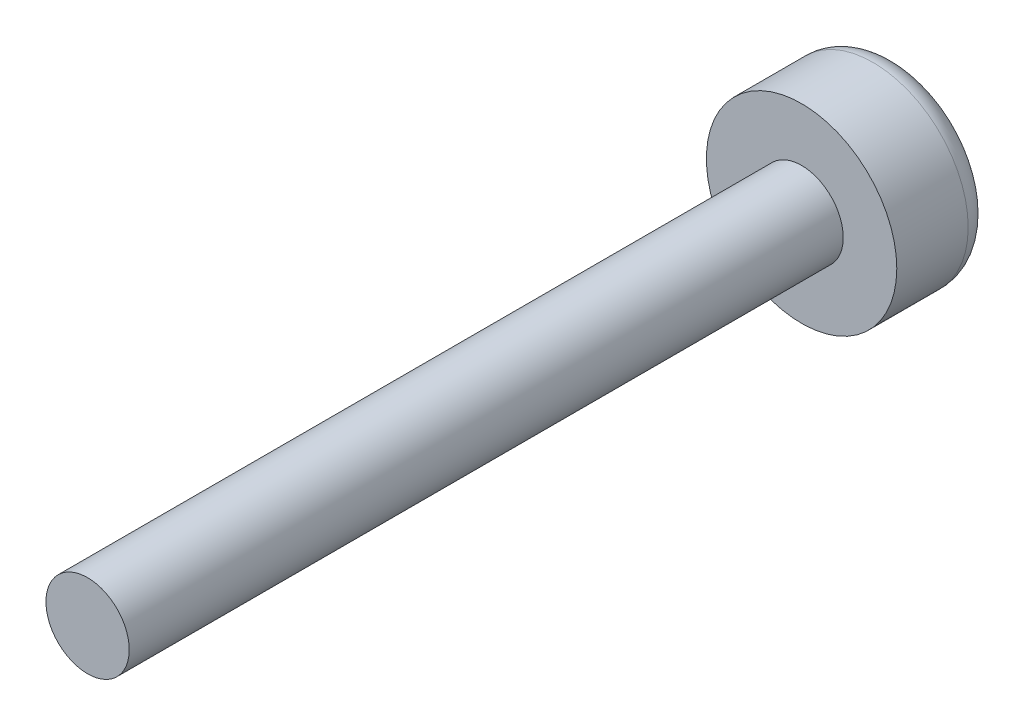
ISO-10303-21;
HEADER;
FILE_DESCRIPTION(('STEP AP214'),'2;1');
FILE_NAME('part.step','',(''),(''),'','','');
FILE_SCHEMA(('AUTOMOTIVE_DESIGN { 1 0 10303 214 1 1 1 1 }'));
ENDSEC;
DATA;
#1=APPLICATION_CONTEXT('core data for automotive mechanical design processes');
#2=APPLICATION_PROTOCOL_DEFINITION('international standard','automotive_design',2000,#1);
#3=PRODUCT_CONTEXT('',#1,'mechanical');
#4=PRODUCT('Part','Part','',(#3));
#5=PRODUCT_RELATED_PRODUCT_CATEGORY('part','',(#4));
#6=PRODUCT_DEFINITION_FORMATION('','',#4);
#7=PRODUCT_DEFINITION_CONTEXT('part definition',#1,'design');
#8=PRODUCT_DEFINITION('design','',#6,#7);
#9=PRODUCT_DEFINITION_SHAPE('','',#8);
#10=(LENGTH_UNIT() NAMED_UNIT(*) SI_UNIT(.MILLI.,.METRE.));
#11=(NAMED_UNIT(*) PLANE_ANGLE_UNIT() SI_UNIT($,.RADIAN.));
#12=(NAMED_UNIT(*) SI_UNIT($,.STERADIAN.) SOLID_ANGLE_UNIT());
#13=UNCERTAINTY_MEASURE_WITH_UNIT(LENGTH_MEASURE(1.E-05),#10,'distance_accuracy_value','');
#14=(GEOMETRIC_REPRESENTATION_CONTEXT(3) GLOBAL_UNCERTAINTY_ASSIGNED_CONTEXT((#13)) GLOBAL_UNIT_ASSIGNED_CONTEXT((#10,
#11,#12)) REPRESENTATION_CONTEXT('',''));
#15=CARTESIAN_POINT('',(0.,0.,0.));
#16=DIRECTION('',(0.,0.,1.));
#17=DIRECTION('',(1.,0.,0.));
#18=AXIS2_PLACEMENT_3D('',#15,#16,#17);
#19=CARTESIAN_POINT('',(0.,0.,4.));
#20=DIRECTION('',(0.,0.,-1.));
#21=DIRECTION('',(-1.,0.,0.));
#22=AXIS2_PLACEMENT_3D('',#19,#20,#21);
#23=CYLINDRICAL_SURFACE('',#22,4.);
#24=CARTESIAN_POINT('',(0.,0.,1.));
#25=DIRECTION('',(0.,0.,1.));
#26=DIRECTION('',(1.,0.,0.));
#27=AXIS2_PLACEMENT_3D('',#24,#25,#26);
#28=CIRCLE('',#27,4.);
#29=CARTESIAN_POINT('',(4.,0.,1.));
#30=VERTEX_POINT('',#29);
#31=EDGE_CURVE('E51',#30,#30,#28,.T.);
#32=ORIENTED_EDGE('',*,*,#31,.T.);
#33=EDGE_LOOP('',(#32));
#34=FACE_BOUND('',#33,.T.);
#35=CARTESIAN_POINT('',(0.,0.,4.));
#36=DIRECTION('',(0.,0.,1.));
#37=DIRECTION('',(1.,0.,0.));
#38=AXIS2_PLACEMENT_3D('',#35,#36,#37);
#39=CIRCLE('',#38,4.);
#40=CARTESIAN_POINT('',(4.,0.,4.));
#41=VERTEX_POINT('',#40);
#42=EDGE_CURVE('E61',#41,#41,#39,.T.);
#43=ORIENTED_EDGE('',*,*,#42,.F.);
#44=EDGE_LOOP('',(#43));
#45=FACE_BOUND('',#44,.T.);
#46=ADVANCED_FACE('F43',(#34,#45),#23,.T.);
#47=CARTESIAN_POINT('',(0.,0.,4.));
#48=DIRECTION('',(0.,0.,1.));
#49=DIRECTION('',(1.,0.,0.));
#50=AXIS2_PLACEMENT_3D('',#47,#48,#49);
#51=PLANE('',#50);
#52=CARTESIAN_POINT('',(0.,0.,4.));
#53=DIRECTION('',(0.,0.,1.));
#54=DIRECTION('',(1.,0.,0.));
#55=AXIS2_PLACEMENT_3D('',#52,#53,#54);
#56=CIRCLE('',#55,1.75);
#57=CARTESIAN_POINT('',(1.75,0.,4.));
#58=VERTEX_POINT('',#57);
#59=EDGE_CURVE('E56',#58,#58,#56,.T.);
#60=ORIENTED_EDGE('',*,*,#59,.F.);
#61=EDGE_LOOP('',(#60));
#62=FACE_BOUND('',#61,.T.);
#63=ORIENTED_EDGE('',*,*,#42,.T.);
#64=EDGE_LOOP('',(#63));
#65=FACE_BOUND('',#64,.T.);
#66=ADVANCED_FACE('F81',(#62,#65),#51,.T.);
#67=CARTESIAN_POINT('',(0.,0.,0.));
#68=DIRECTION('',(0.,0.,1.));
#69=DIRECTION('',(1.,0.,0.));
#70=AXIS2_PLACEMENT_3D('',#67,#68,#69);
#71=PLANE('',#70);
#72=CARTESIAN_POINT('',(0.,0.,0.));
#73=DIRECTION('',(0.,0.,1.));
#74=DIRECTION('',(1.,0.,0.));
#75=AXIS2_PLACEMENT_3D('',#72,#73,#74);
#76=CIRCLE('',#75,3.);
#77=CARTESIAN_POINT('',(3.,0.,0.));
#78=VERTEX_POINT('',#77);
#79=EDGE_CURVE('E10',#78,#78,#76,.F.);
#80=ORIENTED_EDGE('',*,*,#79,.T.);
#81=EDGE_LOOP('',(#80));
#82=FACE_BOUND('',#81,.T.);
#83=ADVANCED_FACE('F77',(#82),#71,.F.);
#84=CARTESIAN_POINT('',(0.,0.,34.));
#85=DIRECTION('',(0.,0.,-1.));
#86=DIRECTION('',(-1.,0.,0.));
#87=AXIS2_PLACEMENT_3D('',#84,#85,#86);
#88=CYLINDRICAL_SURFACE('',#87,1.75);
#89=CARTESIAN_POINT('',(0.,0.,34.));
#90=DIRECTION('',(0.,0.,1.));
#91=DIRECTION('',(1.,0.,0.));
#92=AXIS2_PLACEMENT_3D('',#89,#90,#91);
#93=CIRCLE('',#92,1.75);
#94=CARTESIAN_POINT('',(1.75,0.,34.));
#95=VERTEX_POINT('',#94);
#96=EDGE_CURVE('E66',#95,#95,#93,.T.);
#97=ORIENTED_EDGE('',*,*,#96,.F.);
#98=EDGE_LOOP('',(#97));
#99=FACE_BOUND('',#98,.T.);
#100=ORIENTED_EDGE('',*,*,#59,.T.);
#101=EDGE_LOOP('',(#100));
#102=FACE_BOUND('',#101,.T.);
#103=ADVANCED_FACE('F74',(#99,#102),#88,.T.);
#104=CARTESIAN_POINT('',(0.,0.,34.));
#105=DIRECTION('',(0.,0.,1.));
#106=DIRECTION('',(1.,0.,0.));
#107=AXIS2_PLACEMENT_3D('',#104,#105,#106);
#108=PLANE('',#107);
#109=ORIENTED_EDGE('',*,*,#96,.T.);
#110=EDGE_LOOP('',(#109));
#111=FACE_BOUND('',#110,.T.);
#112=ADVANCED_FACE('F72',(#111),#108,.T.);
#113=CARTESIAN_POINT('',(0.,0.,1.));
#114=DIRECTION('',(0.,0.,1.));
#115=DIRECTION('',(1.,0.,0.));
#116=AXIS2_PLACEMENT_3D('',#113,#114,#115);
#117=TOROIDAL_SURFACE('',#116,3.,1.);
#118=ORIENTED_EDGE('',*,*,#79,.F.);
#119=EDGE_LOOP('',(#118));
#120=FACE_BOUND('',#119,.T.);
#121=ORIENTED_EDGE('',*,*,#31,.F.);
#122=EDGE_LOOP('',(#121));
#123=FACE_BOUND('',#122,.T.);
#124=ADVANCED_FACE('F45',(#120,#123),#117,.T.);
#125=CLOSED_SHELL('',(#46,#66,#83,#103,#112,#124));
#126=MANIFOLD_SOLID_BREP('B2',#125);
#127=ADVANCED_BREP_SHAPE_REPRESENTATION('',(#18,#126),#14);
#128=SHAPE_DEFINITION_REPRESENTATION(#9,#127);
ENDSEC;
END-ISO-10303-21;
